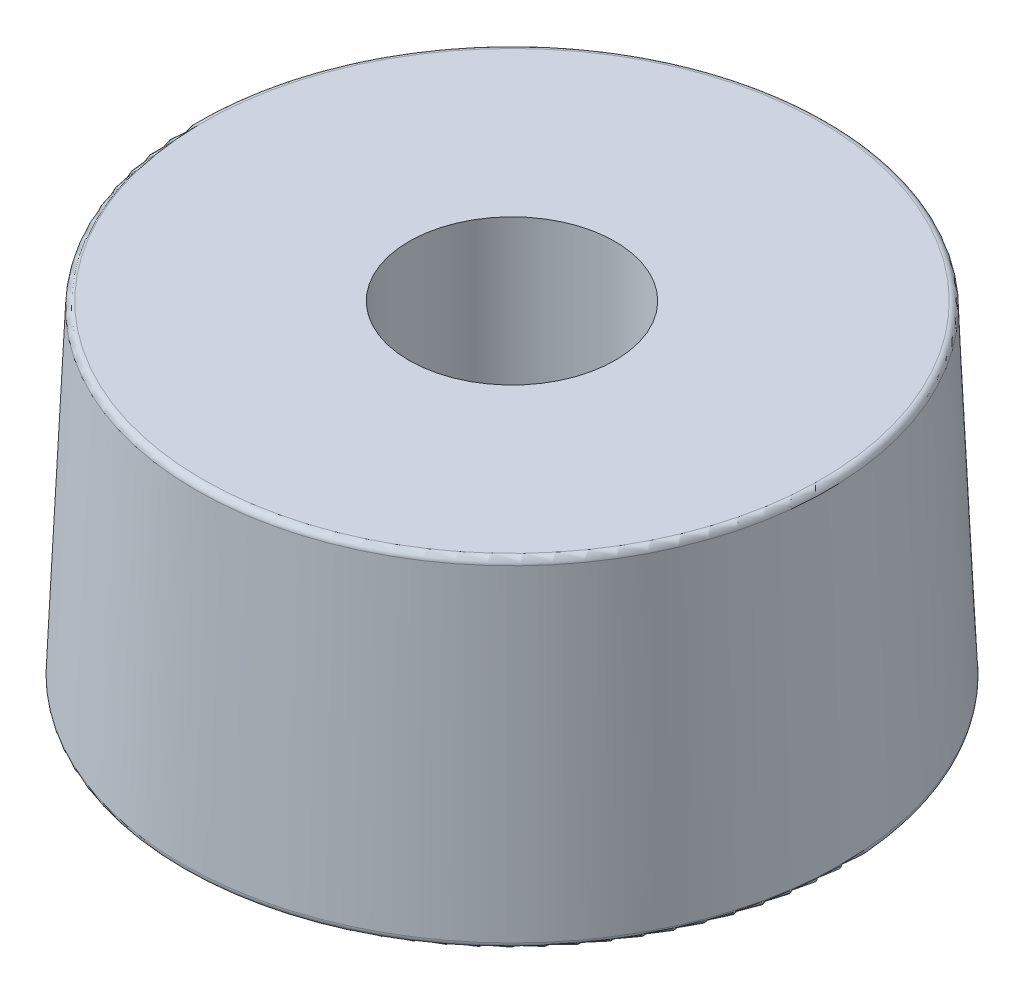
ISO-10303-21;
HEADER;
FILE_DESCRIPTION(('STEP AP214'),'2;1');
FILE_NAME('part.step','',(''),(''),'','','');
FILE_SCHEMA(('AUTOMOTIVE_DESIGN { 1 0 10303 214 1 1 1 1 }'));
ENDSEC;
DATA;
#1=APPLICATION_CONTEXT('core data for automotive mechanical design processes');
#2=APPLICATION_PROTOCOL_DEFINITION('international standard','automotive_design',2000,#1);
#3=PRODUCT_CONTEXT('',#1,'mechanical');
#4=PRODUCT('Part','Part','',(#3));
#5=PRODUCT_RELATED_PRODUCT_CATEGORY('part','',(#4));
#6=PRODUCT_DEFINITION_FORMATION('','',#4);
#7=PRODUCT_DEFINITION_CONTEXT('part definition',#1,'design');
#8=PRODUCT_DEFINITION('design','',#6,#7);
#9=PRODUCT_DEFINITION_SHAPE('','',#8);
#10=(LENGTH_UNIT() NAMED_UNIT(*) SI_UNIT(.MILLI.,.METRE.));
#11=(NAMED_UNIT(*) PLANE_ANGLE_UNIT() SI_UNIT($,.RADIAN.));
#12=(NAMED_UNIT(*) SI_UNIT($,.STERADIAN.) SOLID_ANGLE_UNIT());
#13=UNCERTAINTY_MEASURE_WITH_UNIT(LENGTH_MEASURE(1.E-05),#10,'distance_accuracy_value','');
#14=(GEOMETRIC_REPRESENTATION_CONTEXT(3) GLOBAL_UNCERTAINTY_ASSIGNED_CONTEXT((#13)) GLOBAL_UNIT_ASSIGNED_CONTEXT((#10,
#11,#12)) REPRESENTATION_CONTEXT('',''));
#15=CARTESIAN_POINT('',(0.,0.,0.));
#16=DIRECTION('',(0.,0.,1.));
#17=DIRECTION('',(1.,0.,0.));
#18=AXIS2_PLACEMENT_3D('',#15,#16,#17);
#19=CARTESIAN_POINT('',(0.,12.7,0.));
#20=DIRECTION('',(0.,1.,0.));
#21=DIRECTION('',(0.,0.,1.));
#22=AXIS2_PLACEMENT_3D('',#19,#20,#21);
#23=PLANE('',#22);
#24=CARTESIAN_POINT('',(0.,12.7,0.));
#25=DIRECTION('',(0.,1.,0.));
#26=DIRECTION('',(0.,0.,1.));
#27=AXIS2_PLACEMENT_3D('',#24,#25,#26);
#28=CIRCLE('',#27,23.8123661789962);
#29=CARTESIAN_POINT('',(0.,12.7,23.8123661789962));
#30=VERTEX_POINT('',#29);
#31=EDGE_CURVE('E65',#30,#30,#28,.T.);
#32=ORIENTED_EDGE('',*,*,#31,.T.);
#33=EDGE_LOOP('',(#32));
#34=FACE_BOUND('',#33,.T.);
#35=CARTESIAN_POINT('',(0.,12.7,0.));
#36=DIRECTION('',(0.,1.,0.));
#37=DIRECTION('',(0.,0.,1.));
#38=AXIS2_PLACEMENT_3D('',#35,#36,#37);
#39=CIRCLE('',#38,7.9375);
#40=CARTESIAN_POINT('',(0.,12.7,7.9375));
#41=VERTEX_POINT('',#40);
#42=EDGE_CURVE('E71',#41,#41,#39,.T.);
#43=ORIENTED_EDGE('',*,*,#42,.F.);
#44=EDGE_LOOP('',(#43));
#45=FACE_BOUND('',#44,.T.);
#46=ADVANCED_FACE('F44',(#34,#45),#23,.T.);
#47=CARTESIAN_POINT('',(0.,-12.7,0.));
#48=DIRECTION('',(0.,1.,0.));
#49=DIRECTION('',(0.,0.,1.));
#50=AXIS2_PLACEMENT_3D('',#47,#48,#49);
#51=PLANE('',#50);
#52=CARTESIAN_POINT('',(0.,-12.7,0.));
#53=DIRECTION('',(0.,1.,0.));
#54=DIRECTION('',(0.,0.,1.));
#55=AXIS2_PLACEMENT_3D('',#52,#53,#54);
#56=CIRCLE('',#55,24.8776931859639);
#57=CARTESIAN_POINT('',(0.,-12.7,24.8776931859639));
#58=VERTEX_POINT('',#57);
#59=EDGE_CURVE('E11',#58,#58,#56,.F.);
#60=ORIENTED_EDGE('',*,*,#59,.T.);
#61=EDGE_LOOP('',(#60));
#62=FACE_BOUND('',#61,.T.);
#63=CARTESIAN_POINT('',(0.,-12.7,0.));
#64=DIRECTION('',(0.,1.,0.));
#65=DIRECTION('',(0.,0.,1.));
#66=AXIS2_PLACEMENT_3D('',#63,#64,#65);
#67=CIRCLE('',#66,7.9375);
#68=CARTESIAN_POINT('',(0.,-12.7,7.9375));
#69=VERTEX_POINT('',#68);
#70=EDGE_CURVE('E72',#69,#69,#67,.T.);
#71=ORIENTED_EDGE('',*,*,#70,.T.);
#72=EDGE_LOOP('',(#71));
#73=FACE_BOUND('',#72,.T.);
#74=ADVANCED_FACE('F83',(#62,#73),#51,.F.);
#75=CARTESIAN_POINT('',(0.,12.7,0.));
#76=DIRECTION('',(0.,-1.,0.));
#77=DIRECTION('',(0.,0.,-1.));
#78=AXIS2_PLACEMENT_3D('',#75,#76,#77);
#79=CYLINDRICAL_SURFACE('',#78,7.9375);
#80=ORIENTED_EDGE('',*,*,#42,.T.);
#81=EDGE_LOOP('',(#80));
#82=FACE_BOUND('',#81,.T.);
#83=ORIENTED_EDGE('',*,*,#70,.F.);
#84=EDGE_LOOP('',(#83));
#85=FACE_BOUND('',#84,.T.);
#86=ADVANCED_FACE('F85',(#82,#85),#79,.F.);
#87=CARTESIAN_POINT('',(0.,12.7,0.));
#88=DIRECTION('',(0.,-1.,0.));
#89=DIRECTION('',(0.,0.,-1.));
#90=AXIS2_PLACEMENT_3D('',#87,#88,#89);
#91=CONICAL_SURFACE('',#90,24.2910120501236,0.0436332312998551);
#92=CARTESIAN_POINT('',(0.,12.2218096936827,0.));
#93=DIRECTION('',(0.,1.,0.));
#94=DIRECTION('',(0.,0.,1.));
#95=AXIS2_PLACEMENT_3D('',#92,#93,#94);
#96=CIRCLE('',#95,24.3118902897872);
#97=CARTESIAN_POINT('',(0.,12.2218096936827,24.3118902897872));
#98=VERTEX_POINT('',#97);
#99=EDGE_CURVE('E53',#98,#98,#96,.F.);
#100=ORIENTED_EDGE('',*,*,#99,.T.);
#101=EDGE_LOOP('',(#100));
#102=FACE_BOUND('',#101,.T.);
#103=CARTESIAN_POINT('',(0.,-12.1781903063173,0.));
#104=DIRECTION('',(0.,-1.,0.));
#105=DIRECTION('',(0.,0.,-1.));
#106=AXIS2_PLACEMENT_3D('',#103,#104,#105);
#107=CIRCLE('',#106,25.3772172967548);
#108=CARTESIAN_POINT('',(0.,-12.1781903063173,-25.3772172967548));
#109=VERTEX_POINT('',#108);
#110=EDGE_CURVE('E59',#109,#109,#107,.F.);
#111=ORIENTED_EDGE('',*,*,#110,.T.);
#112=EDGE_LOOP('',(#111));
#113=FACE_BOUND('',#112,.T.);
#114=ADVANCED_FACE('F87',(#102,#113),#91,.T.);
#115=CARTESIAN_POINT('',(0.,12.2,0.));
#116=DIRECTION('',(0.,1.,0.));
#117=DIRECTION('',(0.,0.,1.));
#118=AXIS2_PLACEMENT_3D('',#115,#116,#117);
#119=TOROIDAL_SURFACE('',#118,23.8123661789962,0.5);
#120=ORIENTED_EDGE('',*,*,#99,.F.);
#121=EDGE_LOOP('',(#120));
#122=FACE_BOUND('',#121,.T.);
#123=ORIENTED_EDGE('',*,*,#31,.F.);
#124=EDGE_LOOP('',(#123));
#125=FACE_BOUND('',#124,.T.);
#126=ADVANCED_FACE('F93',(#122,#125),#119,.T.);
#127=CARTESIAN_POINT('',(0.,-12.2,0.));
#128=DIRECTION('',(0.,1.,0.));
#129=DIRECTION('',(0.,0.,1.));
#130=AXIS2_PLACEMENT_3D('',#127,#128,#129);
#131=TOROIDAL_SURFACE('',#130,24.8776931859639,0.5);
#132=ORIENTED_EDGE('',*,*,#59,.F.);
#133=EDGE_LOOP('',(#132));
#134=FACE_BOUND('',#133,.T.);
#135=ORIENTED_EDGE('',*,*,#110,.F.);
#136=EDGE_LOOP('',(#135));
#137=FACE_BOUND('',#136,.T.);
#138=ADVANCED_FACE('F47',(#134,#137),#131,.T.);
#139=CLOSED_SHELL('',(#46,#74,#86,#114,#126,#138));
#140=MANIFOLD_SOLID_BREP('B2',#139);
#141=ADVANCED_BREP_SHAPE_REPRESENTATION('',(#18,#140),#14);
#142=SHAPE_DEFINITION_REPRESENTATION(#9,#141);
ENDSEC;
END-ISO-10303-21;
